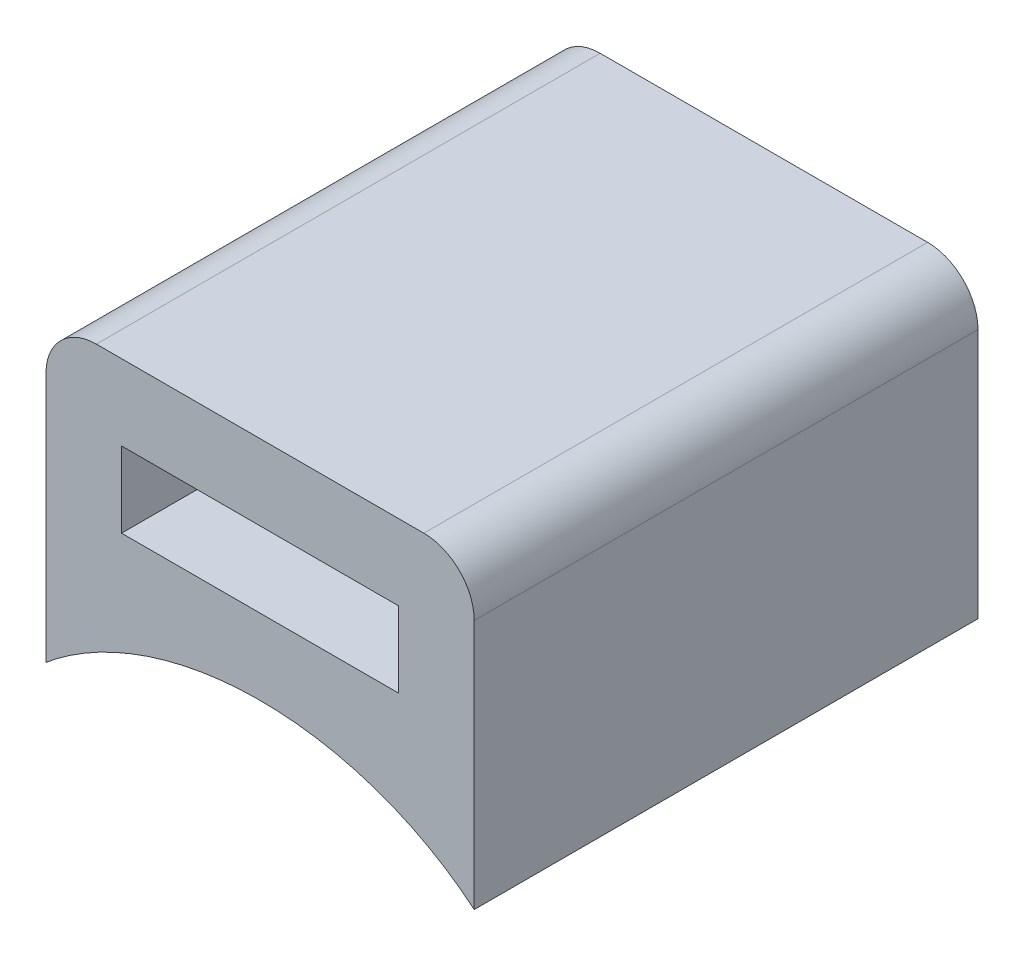
ISO-10303-21;
HEADER;
FILE_DESCRIPTION(('STEP AP214'),'2;1');
FILE_NAME('part.step','',(''),(''),'','','');
FILE_SCHEMA(('AUTOMOTIVE_DESIGN { 1 0 10303 214 1 1 1 1 }'));
ENDSEC;
DATA;
#1=APPLICATION_CONTEXT('core data for automotive mechanical design processes');
#2=APPLICATION_PROTOCOL_DEFINITION('international standard','automotive_design',2000,#1);
#3=PRODUCT_CONTEXT('',#1,'mechanical');
#4=PRODUCT('Part','Part','',(#3));
#5=PRODUCT_RELATED_PRODUCT_CATEGORY('part','',(#4));
#6=PRODUCT_DEFINITION_FORMATION('','',#4);
#7=PRODUCT_DEFINITION_CONTEXT('part definition',#1,'design');
#8=PRODUCT_DEFINITION('design','',#6,#7);
#9=PRODUCT_DEFINITION_SHAPE('','',#8);
#10=(LENGTH_UNIT() NAMED_UNIT(*) SI_UNIT(.MILLI.,.METRE.));
#11=(NAMED_UNIT(*) PLANE_ANGLE_UNIT() SI_UNIT($,.RADIAN.));
#12=(NAMED_UNIT(*) SI_UNIT($,.STERADIAN.) SOLID_ANGLE_UNIT());
#13=UNCERTAINTY_MEASURE_WITH_UNIT(LENGTH_MEASURE(1.E-05),#10,'distance_accuracy_value','');
#14=(GEOMETRIC_REPRESENTATION_CONTEXT(3) GLOBAL_UNCERTAINTY_ASSIGNED_CONTEXT((#13)) GLOBAL_UNIT_ASSIGNED_CONTEXT((#10,
#11,#12)) REPRESENTATION_CONTEXT('',''));
#15=CARTESIAN_POINT('',(0.,0.,0.));
#16=DIRECTION('',(0.,0.,1.));
#17=DIRECTION('',(1.,0.,0.));
#18=AXIS2_PLACEMENT_3D('',#15,#16,#17);
#19=CARTESIAN_POINT('',(0.,10.16,12.7));
#20=DIRECTION('',(0.,1.,0.));
#21=DIRECTION('',(0.,0.,1.));
#22=AXIS2_PLACEMENT_3D('',#19,#20,#21);
#23=PLANE('',#22);
#24=DIRECTION('',(1.,0.,0.));
#25=VECTOR('',#24,1.);
#26=CARTESIAN_POINT('',(0.,10.16,0.));
#27=LINE('',#26,#25);
#28=CARTESIAN_POINT('',(-3.4925,10.16,0.));
#29=VERTEX_POINT('',#28);
#30=CARTESIAN_POINT('',(3.4925,10.16,0.));
#31=VERTEX_POINT('',#30);
#32=EDGE_CURVE('E230',#29,#31,#27,.T.);
#33=ORIENTED_EDGE('',*,*,#32,.T.);
#34=DIRECTION('',(0.,0.,-1.));
#35=VECTOR('',#34,1.);
#36=CARTESIAN_POINT('',(3.4925,10.16,12.7));
#37=LINE('',#36,#35);
#38=CARTESIAN_POINT('',(3.4925,10.16,12.7));
#39=VERTEX_POINT('',#38);
#40=EDGE_CURVE('E207',#39,#31,#37,.T.);
#41=ORIENTED_EDGE('',*,*,#40,.F.);
#42=DIRECTION('',(1.,0.,0.));
#43=VECTOR('',#42,1.);
#44=CARTESIAN_POINT('',(0.,10.16,12.7));
#45=LINE('',#44,#43);
#46=CARTESIAN_POINT('',(-3.4925,10.16,12.7));
#47=VERTEX_POINT('',#46);
#48=EDGE_CURVE('E265',#47,#39,#45,.T.);
#49=ORIENTED_EDGE('',*,*,#48,.F.);
#50=DIRECTION('',(0.,0.,-1.));
#51=VECTOR('',#50,1.);
#52=CARTESIAN_POINT('',(-3.4925,10.16,12.7));
#53=LINE('',#52,#51);
#54=EDGE_CURVE('E131',#47,#29,#53,.T.);
#55=ORIENTED_EDGE('',*,*,#54,.T.);
#56=EDGE_LOOP('',(#33,#41,#49,#55));
#57=FACE_BOUND('',#56,.T.);
#58=ADVANCED_FACE('F41',(#57),#23,.F.);
#59=CARTESIAN_POINT('',(3.4925,0.,12.7));
#60=DIRECTION('',(1.,0.,0.));
#61=DIRECTION('',(0.,0.,-1.));
#62=AXIS2_PLACEMENT_3D('',#59,#60,#61);
#63=PLANE('',#62);
#64=DIRECTION('',(0.,-1.,0.));
#65=VECTOR('',#64,1.);
#66=CARTESIAN_POINT('',(3.4925,0.,0.));
#67=LINE('',#66,#65);
#68=CARTESIAN_POINT('',(3.4925,8.255,0.));
#69=VERTEX_POINT('',#68);
#70=EDGE_CURVE('E233',#31,#69,#67,.T.);
#71=ORIENTED_EDGE('',*,*,#70,.T.);
#72=DIRECTION('',(0.,0.,-1.));
#73=VECTOR('',#72,1.);
#74=CARTESIAN_POINT('',(3.4925,8.255,12.7));
#75=LINE('',#74,#73);
#76=CARTESIAN_POINT('',(3.4925,8.255,12.7));
#77=VERTEX_POINT('',#76);
#78=EDGE_CURVE('E245',#77,#69,#75,.T.);
#79=ORIENTED_EDGE('',*,*,#78,.F.);
#80=DIRECTION('',(0.,-1.,0.));
#81=VECTOR('',#80,1.);
#82=CARTESIAN_POINT('',(3.4925,0.,12.7));
#83=LINE('',#82,#81);
#84=EDGE_CURVE('E260',#39,#77,#83,.T.);
#85=ORIENTED_EDGE('',*,*,#84,.F.);
#86=ORIENTED_EDGE('',*,*,#40,.T.);
#87=EDGE_LOOP('',(#71,#79,#85,#86));
#88=FACE_BOUND('',#87,.T.);
#89=ADVANCED_FACE('F170',(#88),#63,.F.);
#90=CARTESIAN_POINT('',(0.,8.255,12.7));
#91=DIRECTION('',(0.,1.,0.));
#92=DIRECTION('',(0.,0.,1.));
#93=AXIS2_PLACEMENT_3D('',#90,#91,#92);
#94=PLANE('',#93);
#95=DIRECTION('',(1.,0.,0.));
#96=VECTOR('',#95,1.);
#97=CARTESIAN_POINT('',(0.,8.255,0.));
#98=LINE('',#97,#96);
#99=CARTESIAN_POINT('',(-3.4925,8.255,0.));
#100=VERTEX_POINT('',#99);
#101=EDGE_CURVE('E149',#100,#69,#98,.T.);
#102=ORIENTED_EDGE('',*,*,#101,.F.);
#103=DIRECTION('',(0.,0.,-1.));
#104=VECTOR('',#103,1.);
#105=CARTESIAN_POINT('',(-3.4925,8.255,12.7));
#106=LINE('',#105,#104);
#107=CARTESIAN_POINT('',(-3.4925,8.255,12.7));
#108=VERTEX_POINT('',#107);
#109=EDGE_CURVE('E242',#108,#100,#106,.T.);
#110=ORIENTED_EDGE('',*,*,#109,.F.);
#111=DIRECTION('',(1.,0.,0.));
#112=VECTOR('',#111,1.);
#113=CARTESIAN_POINT('',(0.,8.255,12.7));
#114=LINE('',#113,#112);
#115=EDGE_CURVE('E255',#108,#77,#114,.T.);
#116=ORIENTED_EDGE('',*,*,#115,.T.);
#117=ORIENTED_EDGE('',*,*,#78,.T.);
#118=EDGE_LOOP('',(#102,#110,#116,#117));
#119=FACE_BOUND('',#118,.T.);
#120=ADVANCED_FACE('F156',(#119),#94,.T.);
#121=CARTESIAN_POINT('',(0.,0.,12.7));
#122=DIRECTION('',(0.,0.,1.));
#123=DIRECTION('',(-1.,0.,0.));
#124=AXIS2_PLACEMENT_3D('',#121,#122,#123);
#125=ELLIPSE('',#124,7.62,6.35);
#126=DIRECTION('',(0.,0.,-1.));
#127=VECTOR('',#126,1.);
#128=SURFACE_OF_LINEAR_EXTRUSION('',#125,#127);
#129=CARTESIAN_POINT('',(0.,0.,0.));
#130=DIRECTION('',(0.,0.,1.));
#131=DIRECTION('',(-1.,0.,0.));
#132=AXIS2_PLACEMENT_3D('',#129,#130,#131);
#133=ELLIPSE('',#132,7.62,6.35);
#134=CARTESIAN_POINT('',(5.39749999999993,4.48232592073834,0.));
#135=VERTEX_POINT('',#134);
#136=CARTESIAN_POINT('',(-5.39749999999992,4.48232592073833,0.));
#137=VERTEX_POINT('',#136);
#138=EDGE_CURVE('E128',#135,#137,#133,.T.);
#139=ORIENTED_EDGE('',*,*,#138,.F.);
#140=DIRECTION('',(0.,0.,-1.));
#141=VECTOR('',#140,1.);
#142=CARTESIAN_POINT('',(5.39749999999993,4.48232592073834,12.7));
#143=LINE('',#142,#141);
#144=CARTESIAN_POINT('',(5.39749999999993,4.48232592073834,12.7));
#145=VERTEX_POINT('',#144);
#146=EDGE_CURVE('E122',#145,#135,#143,.T.);
#147=ORIENTED_EDGE('',*,*,#146,.F.);
#148=CARTESIAN_POINT('',(-5.39749999999992,4.48232592073833,12.7));
#149=VERTEX_POINT('',#148);
#150=EDGE_CURVE('E126',#145,#149,#125,.T.);
#151=ORIENTED_EDGE('',*,*,#150,.T.);
#152=DIRECTION('',(0.,0.,-1.));
#153=VECTOR('',#152,1.);
#154=CARTESIAN_POINT('',(-5.39749999999992,4.48232592073833,12.7));
#155=LINE('',#154,#153);
#156=EDGE_CURVE('E132',#149,#137,#155,.T.);
#157=ORIENTED_EDGE('',*,*,#156,.T.);
#158=EDGE_LOOP('',(#139,#147,#151,#157));
#159=FACE_BOUND('',#158,.T.);
#160=ADVANCED_FACE('F123',(#159),#128,.T.);
#161=CARTESIAN_POINT('',(5.39749999999988,0.,12.7));
#162=DIRECTION('',(-1.,0.,0.));
#163=DIRECTION('',(0.,-1.,0.));
#164=AXIS2_PLACEMENT_3D('',#161,#162,#163);
#165=PLANE('',#164);
#166=DIRECTION('',(0.,1.,0.));
#167=VECTOR('',#166,1.);
#168=CARTESIAN_POINT('',(5.39749999999988,0.,0.));
#169=LINE('',#168,#167);
#170=CARTESIAN_POINT('',(5.39749999999999,10.795,0.));
#171=VERTEX_POINT('',#170);
#172=EDGE_CURVE('E217',#135,#171,#169,.T.);
#173=ORIENTED_EDGE('',*,*,#172,.T.);
#174=DIRECTION('',(0.,0.,-1.));
#175=VECTOR('',#174,1.);
#176=CARTESIAN_POINT('',(5.39749999999999,10.795,12.7));
#177=LINE('',#176,#175);
#178=CARTESIAN_POINT('',(5.39749999999999,10.795,12.7));
#179=VERTEX_POINT('',#178);
#180=EDGE_CURVE('E65',#171,#179,#177,.F.);
#181=ORIENTED_EDGE('',*,*,#180,.T.);
#182=DIRECTION('',(0.,1.,0.));
#183=VECTOR('',#182,1.);
#184=CARTESIAN_POINT('',(5.39749999999988,0.,12.7));
#185=LINE('',#184,#183);
#186=EDGE_CURVE('E134',#145,#179,#185,.T.);
#187=ORIENTED_EDGE('',*,*,#186,.F.);
#188=ORIENTED_EDGE('',*,*,#146,.T.);
#189=EDGE_LOOP('',(#173,#181,#187,#188));
#190=FACE_BOUND('',#189,.T.);
#191=ADVANCED_FACE('F135',(#190),#165,.F.);
#192=CARTESIAN_POINT('',(0.,12.065,12.7));
#193=DIRECTION('',(0.,-1.,0.));
#194=DIRECTION('',(1.,0.,0.));
#195=AXIS2_PLACEMENT_3D('',#192,#193,#194);
#196=PLANE('',#195);
#197=DIRECTION('',(-1.,0.,0.));
#198=VECTOR('',#197,1.);
#199=CARTESIAN_POINT('',(0.,12.065,12.7));
#200=LINE('',#199,#198);
#201=CARTESIAN_POINT('',(4.12749999999999,12.065,12.7));
#202=VERTEX_POINT('',#201);
#203=CARTESIAN_POINT('',(-4.12749999999999,12.065,12.7));
#204=VERTEX_POINT('',#203);
#205=EDGE_CURVE('E138',#202,#204,#200,.T.);
#206=ORIENTED_EDGE('',*,*,#205,.F.);
#207=DIRECTION('',(0.,0.,-1.));
#208=VECTOR('',#207,1.);
#209=CARTESIAN_POINT('',(4.12749999999999,12.065,12.7));
#210=LINE('',#209,#208);
#211=CARTESIAN_POINT('',(4.12749999999999,12.065,0.));
#212=VERTEX_POINT('',#211);
#213=EDGE_CURVE('E195',#202,#212,#210,.T.);
#214=ORIENTED_EDGE('',*,*,#213,.T.);
#215=DIRECTION('',(-1.,0.,0.));
#216=VECTOR('',#215,1.);
#217=CARTESIAN_POINT('',(0.,12.065,0.));
#218=LINE('',#217,#216);
#219=CARTESIAN_POINT('',(-4.12749999999999,12.065,0.));
#220=VERTEX_POINT('',#219);
#221=EDGE_CURVE('E218',#212,#220,#218,.T.);
#222=ORIENTED_EDGE('',*,*,#221,.T.);
#223=DIRECTION('',(0.,0.,-1.));
#224=VECTOR('',#223,1.);
#225=CARTESIAN_POINT('',(-4.12749999999999,12.065,12.7));
#226=LINE('',#225,#224);
#227=EDGE_CURVE('E198',#220,#204,#226,.F.);
#228=ORIENTED_EDGE('',*,*,#227,.T.);
#229=EDGE_LOOP('',(#206,#214,#222,#228));
#230=FACE_BOUND('',#229,.T.);
#231=ADVANCED_FACE('F184',(#230),#196,.F.);
#232=CARTESIAN_POINT('',(-5.39749999999988,0.,12.7));
#233=DIRECTION('',(1.,0.,0.));
#234=DIRECTION('',(0.,1.,0.));
#235=AXIS2_PLACEMENT_3D('',#232,#233,#234);
#236=PLANE('',#235);
#237=DIRECTION('',(0.,-1.,0.));
#238=VECTOR('',#237,1.);
#239=CARTESIAN_POINT('',(-5.39749999999988,0.,12.7));
#240=LINE('',#239,#238);
#241=CARTESIAN_POINT('',(-5.39749999999999,10.795,12.7));
#242=VERTEX_POINT('',#241);
#243=EDGE_CURVE('E142',#242,#149,#240,.T.);
#244=ORIENTED_EDGE('',*,*,#243,.F.);
#245=DIRECTION('',(0.,0.,-1.));
#246=VECTOR('',#245,1.);
#247=CARTESIAN_POINT('',(-5.39749999999999,10.795,12.7));
#248=LINE('',#247,#246);
#249=CARTESIAN_POINT('',(-5.39749999999999,10.795,0.));
#250=VERTEX_POINT('',#249);
#251=EDGE_CURVE('E11',#242,#250,#248,.T.);
#252=ORIENTED_EDGE('',*,*,#251,.T.);
#253=DIRECTION('',(0.,-1.,0.));
#254=VECTOR('',#253,1.);
#255=CARTESIAN_POINT('',(-5.39749999999988,0.,0.));
#256=LINE('',#255,#254);
#257=EDGE_CURVE('E223',#250,#137,#256,.T.);
#258=ORIENTED_EDGE('',*,*,#257,.T.);
#259=ORIENTED_EDGE('',*,*,#156,.F.);
#260=EDGE_LOOP('',(#244,#252,#258,#259));
#261=FACE_BOUND('',#260,.T.);
#262=ADVANCED_FACE('F181',(#261),#236,.F.);
#263=CARTESIAN_POINT('',(-3.4925,0.,12.7));
#264=DIRECTION('',(1.,0.,0.));
#265=DIRECTION('',(0.,0.,-1.));
#266=AXIS2_PLACEMENT_3D('',#263,#264,#265);
#267=PLANE('',#266);
#268=DIRECTION('',(0.,-1.,0.));
#269=VECTOR('',#268,1.);
#270=CARTESIAN_POINT('',(-3.4925,0.,0.));
#271=LINE('',#270,#269);
#272=EDGE_CURVE('E145',#29,#100,#271,.T.);
#273=ORIENTED_EDGE('',*,*,#272,.F.);
#274=ORIENTED_EDGE('',*,*,#54,.F.);
#275=DIRECTION('',(0.,-1.,0.));
#276=VECTOR('',#275,1.);
#277=CARTESIAN_POINT('',(-3.4925,0.,12.7));
#278=LINE('',#277,#276);
#279=EDGE_CURVE('E252',#47,#108,#278,.T.);
#280=ORIENTED_EDGE('',*,*,#279,.T.);
#281=ORIENTED_EDGE('',*,*,#109,.T.);
#282=EDGE_LOOP('',(#273,#274,#280,#281));
#283=FACE_BOUND('',#282,.T.);
#284=ADVANCED_FACE('F183',(#283),#267,.T.);
#285=CARTESIAN_POINT('',(0.,0.,12.7));
#286=DIRECTION('',(0.,0.,1.));
#287=DIRECTION('',(1.,0.,0.));
#288=AXIS2_PLACEMENT_3D('',#285,#286,#287);
#289=PLANE('',#288);
#290=ORIENTED_EDGE('',*,*,#186,.T.);
#291=CARTESIAN_POINT('',(4.12749999999999,10.795,12.7));
#292=DIRECTION('',(0.,0.,1.));
#293=DIRECTION('',(1.,0.,0.));
#294=AXIS2_PLACEMENT_3D('',#291,#292,#293);
#295=CIRCLE('',#294,1.27);
#296=EDGE_CURVE('E50',#179,#202,#295,.T.);
#297=ORIENTED_EDGE('',*,*,#296,.T.);
#298=ORIENTED_EDGE('',*,*,#205,.T.);
#299=CARTESIAN_POINT('',(-4.12749999999999,10.795,12.7));
#300=DIRECTION('',(0.,0.,1.));
#301=DIRECTION('',(1.,0.,0.));
#302=AXIS2_PLACEMENT_3D('',#299,#300,#301);
#303=CIRCLE('',#302,1.27);
#304=EDGE_CURVE('E57',#204,#242,#303,.T.);
#305=ORIENTED_EDGE('',*,*,#304,.T.);
#306=ORIENTED_EDGE('',*,*,#243,.T.);
#307=ORIENTED_EDGE('',*,*,#150,.F.);
#308=EDGE_LOOP('',(#290,#297,#298,#305,#306,#307));
#309=FACE_BOUND('',#308,.T.);
#310=ORIENTED_EDGE('',*,*,#48,.T.);
#311=ORIENTED_EDGE('',*,*,#84,.T.);
#312=ORIENTED_EDGE('',*,*,#115,.F.);
#313=ORIENTED_EDGE('',*,*,#279,.F.);
#314=EDGE_LOOP('',(#310,#311,#312,#313));
#315=FACE_BOUND('',#314,.T.);
#316=ADVANCED_FACE('F140',(#309,#315),#289,.T.);
#317=CARTESIAN_POINT('',(0.,0.,0.));
#318=DIRECTION('',(0.,0.,1.));
#319=DIRECTION('',(1.,0.,0.));
#320=AXIS2_PLACEMENT_3D('',#317,#318,#319);
#321=PLANE('',#320);
#322=ORIENTED_EDGE('',*,*,#221,.F.);
#323=CARTESIAN_POINT('',(4.12749999999999,10.795,0.));
#324=DIRECTION('',(0.,0.,1.));
#325=DIRECTION('',(1.,0.,0.));
#326=AXIS2_PLACEMENT_3D('',#323,#324,#325);
#327=CIRCLE('',#326,1.27);
#328=EDGE_CURVE('E200',#212,#171,#327,.F.);
#329=ORIENTED_EDGE('',*,*,#328,.T.);
#330=ORIENTED_EDGE('',*,*,#172,.F.);
#331=ORIENTED_EDGE('',*,*,#138,.T.);
#332=ORIENTED_EDGE('',*,*,#257,.F.);
#333=CARTESIAN_POINT('',(-4.12749999999999,10.795,0.));
#334=DIRECTION('',(0.,0.,1.));
#335=DIRECTION('',(1.,0.,0.));
#336=AXIS2_PLACEMENT_3D('',#333,#334,#335);
#337=CIRCLE('',#336,1.27);
#338=EDGE_CURVE('E202',#250,#220,#337,.F.);
#339=ORIENTED_EDGE('',*,*,#338,.T.);
#340=EDGE_LOOP('',(#322,#329,#330,#331,#332,#339));
#341=FACE_BOUND('',#340,.T.);
#342=ORIENTED_EDGE('',*,*,#32,.F.);
#343=ORIENTED_EDGE('',*,*,#272,.T.);
#344=ORIENTED_EDGE('',*,*,#101,.T.);
#345=ORIENTED_EDGE('',*,*,#70,.F.);
#346=EDGE_LOOP('',(#342,#343,#344,#345));
#347=FACE_BOUND('',#346,.T.);
#348=ADVANCED_FACE('F160',(#341,#347),#321,.F.);
#349=CARTESIAN_POINT('',(4.12749999999999,10.795,12.7));
#350=DIRECTION('',(0.,0.,-1.));
#351=DIRECTION('',(-1.,0.,0.));
#352=AXIS2_PLACEMENT_3D('',#349,#350,#351);
#353=CYLINDRICAL_SURFACE('',#352,1.27);
#354=ORIENTED_EDGE('',*,*,#296,.F.);
#355=ORIENTED_EDGE('',*,*,#180,.F.);
#356=ORIENTED_EDGE('',*,*,#328,.F.);
#357=ORIENTED_EDGE('',*,*,#213,.F.);
#358=EDGE_LOOP('',(#354,#355,#356,#357));
#359=FACE_BOUND('',#358,.T.);
#360=ADVANCED_FACE('F158',(#359),#353,.T.);
#361=CARTESIAN_POINT('',(-4.12749999999999,10.795,12.7));
#362=DIRECTION('',(0.,0.,-1.));
#363=DIRECTION('',(-1.,0.,0.));
#364=AXIS2_PLACEMENT_3D('',#361,#362,#363);
#365=CYLINDRICAL_SURFACE('',#364,1.27);
#366=ORIENTED_EDGE('',*,*,#304,.F.);
#367=ORIENTED_EDGE('',*,*,#227,.F.);
#368=ORIENTED_EDGE('',*,*,#338,.F.);
#369=ORIENTED_EDGE('',*,*,#251,.F.);
#370=EDGE_LOOP('',(#366,#367,#368,#369));
#371=FACE_BOUND('',#370,.T.);
#372=ADVANCED_FACE('F43',(#371),#365,.T.);
#373=CLOSED_SHELL('',(#58,#89,#120,#160,#191,#231,#262,#284,#316,#348,#360,#372));
#374=MANIFOLD_SOLID_BREP('B2',#373);
#375=ADVANCED_BREP_SHAPE_REPRESENTATION('',(#18,#374),#14);
#376=SHAPE_DEFINITION_REPRESENTATION(#9,#375);
ENDSEC;
END-ISO-10303-21;
